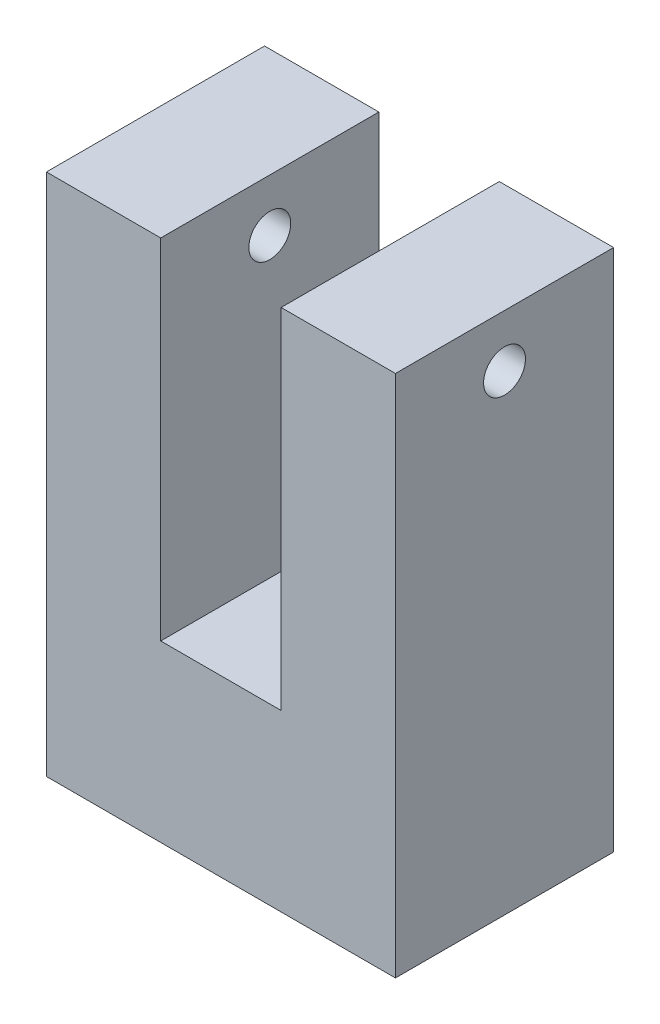
ISO-10303-21;
HEADER;
FILE_DESCRIPTION(('STEP AP214'),'2;1');
FILE_NAME('part.step','',(''),(''),'','','');
FILE_SCHEMA(('AUTOMOTIVE_DESIGN { 1 0 10303 214 1 1 1 1 }'));
ENDSEC;
DATA;
#1=APPLICATION_CONTEXT('core data for automotive mechanical design processes');
#2=APPLICATION_PROTOCOL_DEFINITION('international standard','automotive_design',2000,#1);
#3=PRODUCT_CONTEXT('',#1,'mechanical');
#4=PRODUCT('Part','Part','',(#3));
#5=PRODUCT_RELATED_PRODUCT_CATEGORY('part','',(#4));
#6=PRODUCT_DEFINITION_FORMATION('','',#4);
#7=PRODUCT_DEFINITION_CONTEXT('part definition',#1,'design');
#8=PRODUCT_DEFINITION('design','',#6,#7);
#9=PRODUCT_DEFINITION_SHAPE('','',#8);
#10=(LENGTH_UNIT() NAMED_UNIT(*) SI_UNIT(.MILLI.,.METRE.));
#11=(NAMED_UNIT(*) PLANE_ANGLE_UNIT() SI_UNIT($,.RADIAN.));
#12=(NAMED_UNIT(*) SI_UNIT($,.STERADIAN.) SOLID_ANGLE_UNIT());
#13=UNCERTAINTY_MEASURE_WITH_UNIT(LENGTH_MEASURE(1.E-05),#10,'distance_accuracy_value','');
#14=(GEOMETRIC_REPRESENTATION_CONTEXT(3) GLOBAL_UNCERTAINTY_ASSIGNED_CONTEXT((#13)) GLOBAL_UNIT_ASSIGNED_CONTEXT((#10,
#11,#12)) REPRESENTATION_CONTEXT('',''));
#15=CARTESIAN_POINT('',(0.,0.,0.));
#16=DIRECTION('',(0.,0.,1.));
#17=DIRECTION('',(1.,0.,0.));
#18=AXIS2_PLACEMENT_3D('',#15,#16,#17);
#19=CARTESIAN_POINT('',(0.,38.1,0.));
#20=DIRECTION('',(0.,-1.,0.));
#21=DIRECTION('',(0.,0.,-1.));
#22=AXIS2_PLACEMENT_3D('',#19,#20,#21);
#23=PLANE('',#22);
#24=DIRECTION('',(-1.,0.,0.));
#25=VECTOR('',#24,1.);
#26=CARTESIAN_POINT('',(-12.6999999999999,38.1,-7.93750000000004));
#27=LINE('',#26,#25);
#28=CARTESIAN_POINT('',(12.7000000000001,38.1,-7.93750000000004));
#29=VERTEX_POINT('',#28);
#30=CARTESIAN_POINT('',(4.3815,38.1,-7.93750000000004));
#31=VERTEX_POINT('',#30);
#32=EDGE_CURVE('E90',#29,#31,#27,.T.);
#33=ORIENTED_EDGE('',*,*,#32,.T.);
#34=DIRECTION('',(0.,0.,1.));
#35=VECTOR('',#34,1.);
#36=CARTESIAN_POINT('',(4.3815,38.1,-7.93750000000004));
#37=LINE('',#36,#35);
#38=CARTESIAN_POINT('',(4.3815,38.1,7.93750000000004));
#39=VERTEX_POINT('',#38);
#40=EDGE_CURVE('E112',#31,#39,#37,.T.);
#41=ORIENTED_EDGE('',*,*,#40,.T.);
#42=DIRECTION('',(1.,0.,0.));
#43=VECTOR('',#42,1.);
#44=CARTESIAN_POINT('',(-12.6999999999999,38.1,7.93750000000004));
#45=LINE('',#44,#43);
#46=CARTESIAN_POINT('',(12.7000000000001,38.1,7.93750000000004));
#47=VERTEX_POINT('',#46);
#48=EDGE_CURVE('E61',#39,#47,#45,.T.);
#49=ORIENTED_EDGE('',*,*,#48,.T.);
#50=DIRECTION('',(0.,0.,-1.));
#51=VECTOR('',#50,1.);
#52=CARTESIAN_POINT('',(12.7000000000001,38.1,7.93750000000004));
#53=LINE('',#52,#51);
#54=EDGE_CURVE('E126',#47,#29,#53,.T.);
#55=ORIENTED_EDGE('',*,*,#54,.T.);
#56=EDGE_LOOP('',(#33,#41,#49,#55));
#57=FACE_BOUND('',#56,.T.);
#58=ADVANCED_FACE('F35',(#57),#23,.F.);
#59=CARTESIAN_POINT('',(12.7000000000001,38.1,7.93750000000004));
#60=DIRECTION('',(-1.,0.,0.));
#61=DIRECTION('',(0.,0.,1.));
#62=AXIS2_PLACEMENT_3D('',#59,#60,#61);
#63=PLANE('',#62);
#64=CARTESIAN_POINT('',(12.7000000000001,34.29,0.));
#65=DIRECTION('',(1.,0.,0.));
#66=DIRECTION('',(0.,0.,-1.));
#67=AXIS2_PLACEMENT_3D('',#64,#65,#66);
#68=CIRCLE('',#67,1.524);
#69=CARTESIAN_POINT('',(12.7000000000001,34.29,-1.524));
#70=VERTEX_POINT('',#69);
#71=EDGE_CURVE('E160',#70,#70,#68,.T.);
#72=ORIENTED_EDGE('',*,*,#71,.F.);
#73=EDGE_LOOP('',(#72));
#74=FACE_BOUND('',#73,.T.);
#75=DIRECTION('',(0.,0.,-1.));
#76=VECTOR('',#75,1.);
#77=CARTESIAN_POINT('',(12.7000000000001,0.,7.93750000000004));
#78=LINE('',#77,#76);
#79=CARTESIAN_POINT('',(12.7000000000001,0.,7.93750000000004));
#80=VERTEX_POINT('',#79);
#81=CARTESIAN_POINT('',(12.7000000000001,0.,-7.93750000000004));
#82=VERTEX_POINT('',#81);
#83=EDGE_CURVE('E138',#80,#82,#78,.T.);
#84=ORIENTED_EDGE('',*,*,#83,.T.);
#85=DIRECTION('',(0.,-1.,0.));
#86=VECTOR('',#85,1.);
#87=CARTESIAN_POINT('',(12.7000000000001,38.1,-7.93750000000004));
#88=LINE('',#87,#86);
#89=EDGE_CURVE('E11',#29,#82,#88,.T.);
#90=ORIENTED_EDGE('',*,*,#89,.F.);
#91=ORIENTED_EDGE('',*,*,#54,.F.);
#92=DIRECTION('',(0.,-1.,0.));
#93=VECTOR('',#92,1.);
#94=CARTESIAN_POINT('',(12.7000000000001,38.1,7.93750000000004));
#95=LINE('',#94,#93);
#96=EDGE_CURVE('E137',#47,#80,#95,.T.);
#97=ORIENTED_EDGE('',*,*,#96,.T.);
#98=EDGE_LOOP('',(#84,#90,#91,#97));
#99=FACE_BOUND('',#98,.T.);
#100=ADVANCED_FACE('F37',(#74,#99),#63,.F.);
#101=CARTESIAN_POINT('',(-12.6999999999999,38.1,-7.93750000000004));
#102=DIRECTION('',(0.,0.,1.));
#103=DIRECTION('',(1.,0.,0.));
#104=AXIS2_PLACEMENT_3D('',#101,#102,#103);
#105=PLANE('',#104);
#106=DIRECTION('',(1.,0.,0.));
#107=VECTOR('',#106,1.);
#108=CARTESIAN_POINT('',(-4.3815,12.7,-7.93750000000004));
#109=LINE('',#108,#107);
#110=CARTESIAN_POINT('',(-4.3815,12.7,-7.93750000000004));
#111=VERTEX_POINT('',#110);
#112=CARTESIAN_POINT('',(4.3815,12.7,-7.93750000000004));
#113=VERTEX_POINT('',#112);
#114=EDGE_CURVE('E119',#111,#113,#109,.T.);
#115=ORIENTED_EDGE('',*,*,#114,.T.);
#116=DIRECTION('',(0.,1.,0.));
#117=VECTOR('',#116,1.);
#118=CARTESIAN_POINT('',(4.3815,12.7,-7.93750000000004));
#119=LINE('',#118,#117);
#120=EDGE_CURVE('E114',#113,#31,#119,.T.);
#121=ORIENTED_EDGE('',*,*,#120,.T.);
#122=ORIENTED_EDGE('',*,*,#32,.F.);
#123=ORIENTED_EDGE('',*,*,#89,.T.);
#124=DIRECTION('',(-1.,0.,0.));
#125=VECTOR('',#124,1.);
#126=CARTESIAN_POINT('',(-12.6999999999999,0.,-7.93750000000004));
#127=LINE('',#126,#125);
#128=CARTESIAN_POINT('',(-12.6999999999999,0.,-7.93750000000004));
#129=VERTEX_POINT('',#128);
#130=EDGE_CURVE('E141',#82,#129,#127,.T.);
#131=ORIENTED_EDGE('',*,*,#130,.T.);
#132=DIRECTION('',(0.,-1.,0.));
#133=VECTOR('',#132,1.);
#134=CARTESIAN_POINT('',(-12.6999999999999,38.1,-7.93750000000004));
#135=LINE('',#134,#133);
#136=CARTESIAN_POINT('',(-12.6999999999999,38.1,-7.93750000000004));
#137=VERTEX_POINT('',#136);
#138=EDGE_CURVE('E44',#137,#129,#135,.T.);
#139=ORIENTED_EDGE('',*,*,#138,.F.);
#140=CARTESIAN_POINT('',(-4.3815,38.1,-7.93750000000004));
#141=VERTEX_POINT('',#140);
#142=EDGE_CURVE('E129',#141,#137,#27,.T.);
#143=ORIENTED_EDGE('',*,*,#142,.F.);
#144=DIRECTION('',(0.,-1.,0.));
#145=VECTOR('',#144,1.);
#146=CARTESIAN_POINT('',(-4.3815,12.7,-7.93750000000004));
#147=LINE('',#146,#145);
#148=EDGE_CURVE('E52',#141,#111,#147,.T.);
#149=ORIENTED_EDGE('',*,*,#148,.T.);
#150=EDGE_LOOP('',(#115,#121,#122,#123,#131,#139,#143,#149));
#151=FACE_BOUND('',#150,.T.);
#152=ADVANCED_FACE('F121',(#151),#105,.F.);
#153=CARTESIAN_POINT('',(-12.6999999999999,38.1,7.93750000000004));
#154=DIRECTION('',(1.,0.,0.));
#155=DIRECTION('',(0.,0.,-1.));
#156=AXIS2_PLACEMENT_3D('',#153,#154,#155);
#157=PLANE('',#156);
#158=CARTESIAN_POINT('',(-12.6999999999999,34.29,0.));
#159=DIRECTION('',(1.,0.,0.));
#160=DIRECTION('',(0.,0.,-1.));
#161=AXIS2_PLACEMENT_3D('',#158,#159,#160);
#162=CIRCLE('',#161,1.524);
#163=CARTESIAN_POINT('',(-12.6999999999999,34.29,-1.524));
#164=VERTEX_POINT('',#163);
#165=EDGE_CURVE('E154',#164,#164,#162,.T.);
#166=ORIENTED_EDGE('',*,*,#165,.T.);
#167=EDGE_LOOP('',(#166));
#168=FACE_BOUND('',#167,.T.);
#169=DIRECTION('',(0.,0.,1.));
#170=VECTOR('',#169,1.);
#171=CARTESIAN_POINT('',(-12.6999999999999,0.,7.93750000000004));
#172=LINE('',#171,#170);
#173=CARTESIAN_POINT('',(-12.6999999999999,0.,7.93750000000004));
#174=VERTEX_POINT('',#173);
#175=EDGE_CURVE('E144',#129,#174,#172,.T.);
#176=ORIENTED_EDGE('',*,*,#175,.T.);
#177=DIRECTION('',(0.,-1.,0.));
#178=VECTOR('',#177,1.);
#179=CARTESIAN_POINT('',(-12.6999999999999,38.1,7.93750000000004));
#180=LINE('',#179,#178);
#181=CARTESIAN_POINT('',(-12.6999999999999,38.1,7.93750000000004));
#182=VERTEX_POINT('',#181);
#183=EDGE_CURVE('E148',#182,#174,#180,.T.);
#184=ORIENTED_EDGE('',*,*,#183,.F.);
#185=DIRECTION('',(0.,0.,1.));
#186=VECTOR('',#185,1.);
#187=CARTESIAN_POINT('',(-12.6999999999999,38.1,7.93750000000004));
#188=LINE('',#187,#186);
#189=EDGE_CURVE('E128',#137,#182,#188,.T.);
#190=ORIENTED_EDGE('',*,*,#189,.F.);
#191=ORIENTED_EDGE('',*,*,#138,.T.);
#192=EDGE_LOOP('',(#176,#184,#190,#191));
#193=FACE_BOUND('',#192,.T.);
#194=ADVANCED_FACE('F192',(#168,#193),#157,.F.);
#195=CARTESIAN_POINT('',(-12.6999999999999,38.1,7.93750000000004));
#196=DIRECTION('',(0.,0.,-1.));
#197=DIRECTION('',(-1.,0.,0.));
#198=AXIS2_PLACEMENT_3D('',#195,#196,#197);
#199=PLANE('',#198);
#200=ORIENTED_EDGE('',*,*,#48,.F.);
#201=DIRECTION('',(0.,1.,0.));
#202=VECTOR('',#201,1.);
#203=CARTESIAN_POINT('',(4.3815,12.7,7.93750000000004));
#204=LINE('',#203,#202);
#205=CARTESIAN_POINT('',(4.3815,12.7,7.93750000000004));
#206=VERTEX_POINT('',#205);
#207=EDGE_CURVE('E117',#206,#39,#204,.T.);
#208=ORIENTED_EDGE('',*,*,#207,.F.);
#209=DIRECTION('',(1.,0.,0.));
#210=VECTOR('',#209,1.);
#211=CARTESIAN_POINT('',(-4.3815,12.7,7.93750000000004));
#212=LINE('',#211,#210);
#213=CARTESIAN_POINT('',(-4.3815,12.7,7.93750000000004));
#214=VERTEX_POINT('',#213);
#215=EDGE_CURVE('E123',#214,#206,#212,.T.);
#216=ORIENTED_EDGE('',*,*,#215,.F.);
#217=DIRECTION('',(0.,-1.,0.));
#218=VECTOR('',#217,1.);
#219=CARTESIAN_POINT('',(-4.3815,12.7,7.93750000000004));
#220=LINE('',#219,#218);
#221=CARTESIAN_POINT('',(-4.3815,38.1,7.93750000000004));
#222=VERTEX_POINT('',#221);
#223=EDGE_CURVE('E172',#222,#214,#220,.T.);
#224=ORIENTED_EDGE('',*,*,#223,.F.);
#225=EDGE_CURVE('E134',#182,#222,#45,.T.);
#226=ORIENTED_EDGE('',*,*,#225,.F.);
#227=ORIENTED_EDGE('',*,*,#183,.T.);
#228=DIRECTION('',(1.,0.,0.));
#229=VECTOR('',#228,1.);
#230=CARTESIAN_POINT('',(-12.6999999999999,0.,7.93750000000004));
#231=LINE('',#230,#229);
#232=EDGE_CURVE('E83',#174,#80,#231,.T.);
#233=ORIENTED_EDGE('',*,*,#232,.T.);
#234=ORIENTED_EDGE('',*,*,#96,.F.);
#235=EDGE_LOOP('',(#200,#208,#216,#224,#226,#227,#233,#234));
#236=FACE_BOUND('',#235,.T.);
#237=ADVANCED_FACE('F186',(#236),#199,.F.);
#238=ORIENTED_EDGE('',*,*,#225,.T.);
#239=DIRECTION('',(0.,0.,1.));
#240=VECTOR('',#239,1.);
#241=CARTESIAN_POINT('',(-4.3815,38.1,-7.93750000000004));
#242=LINE('',#241,#240);
#243=EDGE_CURVE('E118',#141,#222,#242,.T.);
#244=ORIENTED_EDGE('',*,*,#243,.F.);
#245=ORIENTED_EDGE('',*,*,#142,.T.);
#246=ORIENTED_EDGE('',*,*,#189,.T.);
#247=EDGE_LOOP('',(#238,#244,#245,#246));
#248=FACE_BOUND('',#247,.T.);
#249=ADVANCED_FACE('F187',(#248),#23,.F.);
#250=CARTESIAN_POINT('',(0.,0.,0.));
#251=DIRECTION('',(0.,-1.,0.));
#252=DIRECTION('',(0.,0.,-1.));
#253=AXIS2_PLACEMENT_3D('',#250,#251,#252);
#254=PLANE('',#253);
#255=CARTESIAN_POINT('',(0.,0.,0.));
#256=DIRECTION('',(0.,-1.,0.));
#257=DIRECTION('',(0.,0.,-1.));
#258=AXIS2_PLACEMENT_3D('',#255,#256,#257);
#259=CIRCLE('',#258,2.0955);
#260=CARTESIAN_POINT('',(0.,0.,-2.0955));
#261=VERTEX_POINT('',#260);
#262=EDGE_CURVE('E167',#261,#261,#259,.T.);
#263=ORIENTED_EDGE('',*,*,#262,.F.);
#264=EDGE_LOOP('',(#263));
#265=FACE_BOUND('',#264,.T.);
#266=ORIENTED_EDGE('',*,*,#83,.F.);
#267=ORIENTED_EDGE('',*,*,#232,.F.);
#268=ORIENTED_EDGE('',*,*,#175,.F.);
#269=ORIENTED_EDGE('',*,*,#130,.F.);
#270=EDGE_LOOP('',(#266,#267,#268,#269));
#271=FACE_BOUND('',#270,.T.);
#272=ADVANCED_FACE('F196',(#265,#271),#254,.T.);
#273=CARTESIAN_POINT('',(4.3815,12.7,-7.93750000000004));
#274=DIRECTION('',(1.,0.,0.));
#275=DIRECTION('',(0.,0.,-1.));
#276=AXIS2_PLACEMENT_3D('',#273,#274,#275);
#277=PLANE('',#276);
#278=CARTESIAN_POINT('',(4.3815,34.29,0.));
#279=DIRECTION('',(1.,0.,0.));
#280=DIRECTION('',(0.,0.,-1.));
#281=AXIS2_PLACEMENT_3D('',#278,#279,#280);
#282=CIRCLE('',#281,1.524);
#283=CARTESIAN_POINT('',(4.3815,34.29,-1.524));
#284=VERTEX_POINT('',#283);
#285=EDGE_CURVE('E153',#284,#284,#282,.T.);
#286=ORIENTED_EDGE('',*,*,#285,.T.);
#287=EDGE_LOOP('',(#286));
#288=FACE_BOUND('',#287,.T.);
#289=ORIENTED_EDGE('',*,*,#207,.T.);
#290=ORIENTED_EDGE('',*,*,#40,.F.);
#291=ORIENTED_EDGE('',*,*,#120,.F.);
#292=DIRECTION('',(0.,0.,1.));
#293=VECTOR('',#292,1.);
#294=CARTESIAN_POINT('',(4.3815,12.7,-7.93750000000004));
#295=LINE('',#294,#293);
#296=EDGE_CURVE('E142',#113,#206,#295,.T.);
#297=ORIENTED_EDGE('',*,*,#296,.T.);
#298=EDGE_LOOP('',(#289,#290,#291,#297));
#299=FACE_BOUND('',#298,.T.);
#300=ADVANCED_FACE('F113',(#288,#299),#277,.F.);
#301=CARTESIAN_POINT('',(-4.3815,12.7,-7.93750000000004));
#302=DIRECTION('',(0.,-1.,0.));
#303=DIRECTION('',(0.,0.,-1.));
#304=AXIS2_PLACEMENT_3D('',#301,#302,#303);
#305=PLANE('',#304);
#306=CARTESIAN_POINT('',(0.,12.7,0.));
#307=DIRECTION('',(0.,-1.,0.));
#308=DIRECTION('',(0.,0.,-1.));
#309=AXIS2_PLACEMENT_3D('',#306,#307,#308);
#310=CIRCLE('',#309,2.0955);
#311=CARTESIAN_POINT('',(0.,12.7,-2.0955));
#312=VERTEX_POINT('',#311);
#313=EDGE_CURVE('E39',#312,#312,#310,.T.);
#314=ORIENTED_EDGE('',*,*,#313,.T.);
#315=EDGE_LOOP('',(#314));
#316=FACE_BOUND('',#315,.T.);
#317=ORIENTED_EDGE('',*,*,#215,.T.);
#318=ORIENTED_EDGE('',*,*,#296,.F.);
#319=ORIENTED_EDGE('',*,*,#114,.F.);
#320=DIRECTION('',(0.,0.,1.));
#321=VECTOR('',#320,1.);
#322=CARTESIAN_POINT('',(-4.3815,12.7,-7.93750000000004));
#323=LINE('',#322,#321);
#324=EDGE_CURVE('E178',#111,#214,#323,.T.);
#325=ORIENTED_EDGE('',*,*,#324,.T.);
#326=EDGE_LOOP('',(#317,#318,#319,#325));
#327=FACE_BOUND('',#326,.T.);
#328=ADVANCED_FACE('F216',(#316,#327),#305,.F.);
#329=CARTESIAN_POINT('',(-4.3815,12.7,-7.93750000000004));
#330=DIRECTION('',(-1.,0.,0.));
#331=DIRECTION('',(0.,0.,1.));
#332=AXIS2_PLACEMENT_3D('',#329,#330,#331);
#333=PLANE('',#332);
#334=CARTESIAN_POINT('',(-4.3815,34.29,0.));
#335=DIRECTION('',(-1.,0.,0.));
#336=DIRECTION('',(0.,0.,1.));
#337=AXIS2_PLACEMENT_3D('',#334,#335,#336);
#338=CIRCLE('',#337,1.524);
#339=CARTESIAN_POINT('',(-4.3815,34.29,1.524));
#340=VERTEX_POINT('',#339);
#341=EDGE_CURVE('E151',#340,#340,#338,.T.);
#342=ORIENTED_EDGE('',*,*,#341,.T.);
#343=EDGE_LOOP('',(#342));
#344=FACE_BOUND('',#343,.T.);
#345=ORIENTED_EDGE('',*,*,#223,.T.);
#346=ORIENTED_EDGE('',*,*,#324,.F.);
#347=ORIENTED_EDGE('',*,*,#148,.F.);
#348=ORIENTED_EDGE('',*,*,#243,.T.);
#349=EDGE_LOOP('',(#345,#346,#347,#348));
#350=FACE_BOUND('',#349,.T.);
#351=ADVANCED_FACE('F181',(#344,#350),#333,.F.);
#352=CARTESIAN_POINT('',(-12.6999999999999,34.29,0.));
#353=DIRECTION('',(1.,0.,0.));
#354=DIRECTION('',(0.,0.,-1.));
#355=AXIS2_PLACEMENT_3D('',#352,#353,#354);
#356=CYLINDRICAL_SURFACE('',#355,1.524);
#357=ORIENTED_EDGE('',*,*,#165,.F.);
#358=EDGE_LOOP('',(#357));
#359=FACE_BOUND('',#358,.T.);
#360=ORIENTED_EDGE('',*,*,#341,.F.);
#361=EDGE_LOOP('',(#360));
#362=FACE_BOUND('',#361,.T.);
#363=ADVANCED_FACE('F211',(#359,#362),#356,.F.);
#364=ORIENTED_EDGE('',*,*,#71,.T.);
#365=EDGE_LOOP('',(#364));
#366=FACE_BOUND('',#365,.T.);
#367=ORIENTED_EDGE('',*,*,#285,.F.);
#368=EDGE_LOOP('',(#367));
#369=FACE_BOUND('',#368,.T.);
#370=ADVANCED_FACE('F207',(#366,#369),#356,.F.);
#371=CARTESIAN_POINT('',(0.,38.1,0.));
#372=DIRECTION('',(0.,-1.,0.));
#373=DIRECTION('',(0.,0.,-1.));
#374=AXIS2_PLACEMENT_3D('',#371,#372,#373);
#375=CYLINDRICAL_SURFACE('',#374,2.0955);
#376=CARTESIAN_POINT('',(0.,0.,-2.0955));
#377=CARTESIAN_POINT('',(0.,0.132291666666666,-2.0955));
#378=CARTESIAN_POINT('',(0.,0.264583333333332,-2.0955));
#379=CARTESIAN_POINT('',(0.,0.529166666666666,-2.0955));
#380=CARTESIAN_POINT('',(0.,0.661458333333334,-2.0955));
#381=CARTESIAN_POINT('',(0.,0.926041666666669,-2.0955));
#382=CARTESIAN_POINT('',(0.,1.05833333333333,-2.0955));
#383=CARTESIAN_POINT('',(0.,1.32291666666667,-2.0955));
#384=CARTESIAN_POINT('',(0.,1.45520833333333,-2.0955));
#385=CARTESIAN_POINT('',(0.,1.71979166666667,-2.0955));
#386=CARTESIAN_POINT('',(0.,1.85208333333334,-2.0955));
#387=CARTESIAN_POINT('',(0.,2.11666666666667,-2.0955));
#388=CARTESIAN_POINT('',(0.,2.24895833333334,-2.0955));
#389=CARTESIAN_POINT('',(0.,2.51354166666667,-2.0955));
#390=CARTESIAN_POINT('',(0.,2.64583333333333,-2.0955));
#391=CARTESIAN_POINT('',(0.,2.91041666666667,-2.0955));
#392=CARTESIAN_POINT('',(0.,3.04270833333334,-2.0955));
#393=CARTESIAN_POINT('',(0.,3.30729166666667,-2.0955));
#394=CARTESIAN_POINT('',(0.,3.43958333333334,-2.0955));
#395=CARTESIAN_POINT('',(0.,3.70416666666667,-2.0955));
#396=CARTESIAN_POINT('',(0.,3.83645833333334,-2.0955));
#397=CARTESIAN_POINT('',(0.,4.10104166666667,-2.0955));
#398=CARTESIAN_POINT('',(0.,4.23333333333334,-2.0955));
#399=CARTESIAN_POINT('',(0.,4.49791666666667,-2.0955));
#400=CARTESIAN_POINT('',(0.,4.63020833333334,-2.0955));
#401=CARTESIAN_POINT('',(0.,4.89479166666667,-2.0955));
#402=CARTESIAN_POINT('',(0.,5.02708333333334,-2.0955));
#403=CARTESIAN_POINT('',(0.,5.29166666666667,-2.0955));
#404=CARTESIAN_POINT('',(0.,5.42395833333334,-2.0955));
#405=CARTESIAN_POINT('',(0.,5.68854166666667,-2.0955));
#406=CARTESIAN_POINT('',(0.,5.82083333333334,-2.0955));
#407=CARTESIAN_POINT('',(0.,6.08541666666667,-2.0955));
#408=CARTESIAN_POINT('',(0.,6.21770833333334,-2.0955));
#409=CARTESIAN_POINT('',(0.,6.48229166666667,-2.0955));
#410=CARTESIAN_POINT('',(0.,6.61458333333334,-2.0955));
#411=CARTESIAN_POINT('',(0.,6.87916666666667,-2.0955));
#412=CARTESIAN_POINT('',(0.,7.01145833333334,-2.0955));
#413=CARTESIAN_POINT('',(0.,7.27604166666667,-2.0955));
#414=CARTESIAN_POINT('',(0.,7.40833333333333,-2.0955));
#415=CARTESIAN_POINT('',(0.,7.67291666666667,-2.0955));
#416=CARTESIAN_POINT('',(0.,7.80520833333334,-2.0955));
#417=CARTESIAN_POINT('',(0.,8.06979166666667,-2.0955));
#418=CARTESIAN_POINT('',(0.,8.20208333333334,-2.0955));
#419=CARTESIAN_POINT('',(0.,8.46666666666667,-2.0955));
#420=CARTESIAN_POINT('',(0.,8.59895833333334,-2.0955));
#421=CARTESIAN_POINT('',(0.,8.86354166666667,-2.0955));
#422=CARTESIAN_POINT('',(0.,8.99583333333334,-2.0955));
#423=CARTESIAN_POINT('',(0.,9.26041666666667,-2.0955));
#424=CARTESIAN_POINT('',(0.,9.39270833333334,-2.0955));
#425=CARTESIAN_POINT('',(0.,9.65729166666667,-2.0955));
#426=CARTESIAN_POINT('',(0.,9.78958333333334,-2.0955));
#427=CARTESIAN_POINT('',(0.,10.0541666666667,-2.0955));
#428=CARTESIAN_POINT('',(0.,10.1864583333333,-2.0955));
#429=CARTESIAN_POINT('',(0.,10.4510416666667,-2.0955));
#430=CARTESIAN_POINT('',(0.,10.5833333333333,-2.0955));
#431=CARTESIAN_POINT('',(0.,10.8479166666667,-2.0955));
#432=CARTESIAN_POINT('',(0.,10.9802083333333,-2.0955));
#433=CARTESIAN_POINT('',(0.,11.2447916666667,-2.0955));
#434=CARTESIAN_POINT('',(0.,11.3770833333333,-2.0955));
#435=CARTESIAN_POINT('',(0.,11.6416666666667,-2.0955));
#436=CARTESIAN_POINT('',(0.,11.7739583333333,-2.0955));
#437=CARTESIAN_POINT('',(0.,12.0385416666667,-2.0955));
#438=CARTESIAN_POINT('',(0.,12.1708333333333,-2.0955));
#439=CARTESIAN_POINT('',(0.,12.4354166666667,-2.0955));
#440=CARTESIAN_POINT('',(0.,12.5677083333333,-2.0955));
#441=CARTESIAN_POINT('',(0.,12.7,-2.0955));
#442=B_SPLINE_CURVE_WITH_KNOTS('',3,(#376,#377,#378,#379,#380,#381,#382,#383,#384,#385,#386,
#387,#388,#389,#390,#391,#392,#393,#394,#395,#396,#397,#398,#399,#400,#401,#402,#403,#404,#405,
#406,#407,#408,#409,#410,#411,#412,#413,#414,#415,#416,#417,#418,#419,#420,#421,#422,#423,#424,
#425,#426,#427,#428,#429,#430,#431,#432,#433,#434,#435,#436,#437,#438,#439,#440,#441),
.UNSPECIFIED.,.F.,.F.,(4,2,2,2,2,2,2,2,2,2,2,2,2,2,2,2,2,2,2,2,2,2,2,2,2,2,2,2,2,2,2,2,4),(0.,
0.396874999999998,0.793750000000003,1.190625,1.5875,1.984375,2.38125,2.778125,3.175,3.571875,
3.96875000000001,4.365625,4.7625,5.15937500000001,5.55625000000001,5.953125,6.35000000000001,
6.74687500000001,7.14375,7.540625,7.9375,8.334375,8.73125,9.128125,9.525,9.921875,10.31875,
10.715625,11.1125,11.509375,11.90625,12.303125,12.7),.UNSPECIFIED.);
#443=EDGE_CURVE('BSEAM210',#261,#312,#442,.T.);
#444=ORIENTED_EDGE('',*,*,#262,.T.);
#445=ORIENTED_EDGE('',*,*,#313,.F.);
#446=ORIENTED_EDGE('',*,*,#443,.T.);
#447=ORIENTED_EDGE('',*,*,#443,.F.);
#448=EDGE_LOOP('',(#444,#446,#445,#447));
#449=FACE_BOUND('',#448,.T.);
#450=ADVANCED_FACE('F210',(#449),#375,.F.);
#451=CLOSED_SHELL('',(#58,#100,#152,#194,#237,#249,#272,#300,#328,#351,#363,#370,#450));
#452=MANIFOLD_SOLID_BREP('B2',#451);
#453=ADVANCED_BREP_SHAPE_REPRESENTATION('',(#18,#452),#14);
#454=SHAPE_DEFINITION_REPRESENTATION(#9,#453);
ENDSEC;
END-ISO-10303-21;
